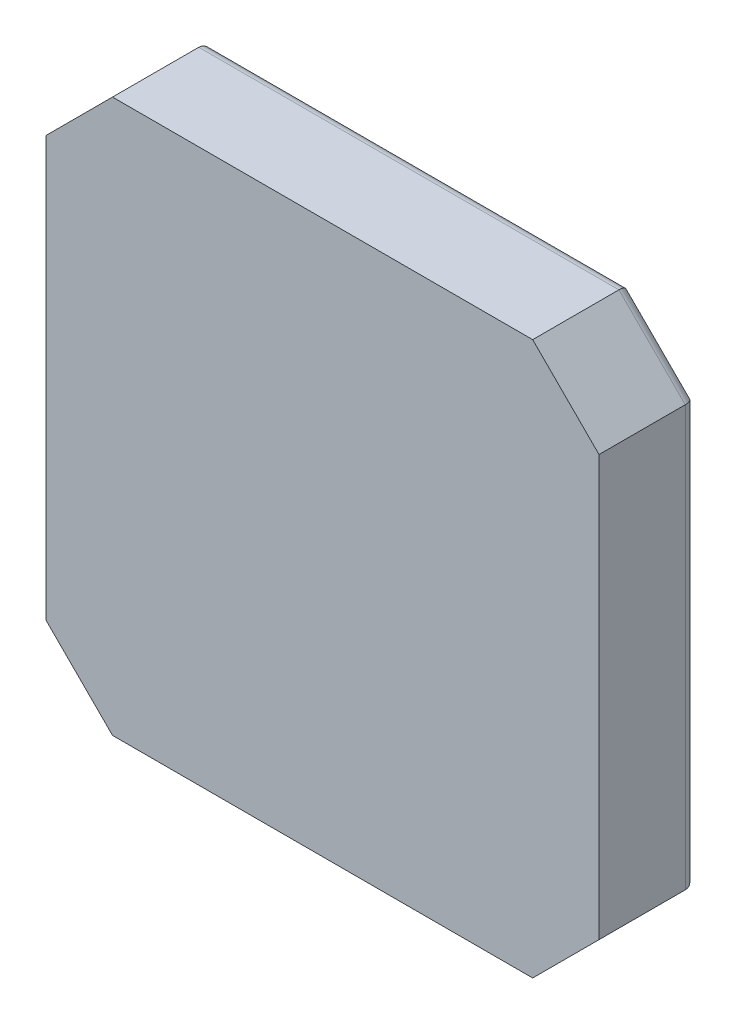
ISO-10303-21;
HEADER;
FILE_DESCRIPTION(('STEP AP214'),'2;1');
FILE_NAME('part.step','',(''),(''),'','','');
FILE_SCHEMA(('AUTOMOTIVE_DESIGN { 1 0 10303 214 1 1 1 1 }'));
ENDSEC;
DATA;
#1=APPLICATION_CONTEXT('core data for automotive mechanical design processes');
#2=APPLICATION_PROTOCOL_DEFINITION('international standard','automotive_design',2000,#1);
#3=PRODUCT_CONTEXT('',#1,'mechanical');
#4=PRODUCT('Part','Part','',(#3));
#5=PRODUCT_RELATED_PRODUCT_CATEGORY('part','',(#4));
#6=PRODUCT_DEFINITION_FORMATION('','',#4);
#7=PRODUCT_DEFINITION_CONTEXT('part definition',#1,'design');
#8=PRODUCT_DEFINITION('design','',#6,#7);
#9=PRODUCT_DEFINITION_SHAPE('','',#8);
#10=(LENGTH_UNIT() NAMED_UNIT(*) SI_UNIT(.MILLI.,.METRE.));
#11=(NAMED_UNIT(*) PLANE_ANGLE_UNIT() SI_UNIT($,.RADIAN.));
#12=(NAMED_UNIT(*) SI_UNIT($,.STERADIAN.) SOLID_ANGLE_UNIT());
#13=UNCERTAINTY_MEASURE_WITH_UNIT(LENGTH_MEASURE(1.E-05),#10,'distance_accuracy_value','');
#14=(GEOMETRIC_REPRESENTATION_CONTEXT(3) GLOBAL_UNCERTAINTY_ASSIGNED_CONTEXT((#13)) GLOBAL_UNIT_ASSIGNED_CONTEXT((#10,
#11,#12)) REPRESENTATION_CONTEXT('',''));
#15=CARTESIAN_POINT('',(0.,0.,0.));
#16=DIRECTION('',(0.,0.,1.));
#17=DIRECTION('',(1.,0.,0.));
#18=AXIS2_PLACEMENT_3D('',#15,#16,#17);
#19=CARTESIAN_POINT('',(0.,0.,3.1));
#20=DIRECTION('',(0.,0.,-1.));
#21=DIRECTION('',(-1.,0.,0.));
#22=AXIS2_PLACEMENT_3D('',#19,#20,#21);
#23=PLANE('',#22);
#24=DIRECTION('',(0.,1.,0.));
#25=VECTOR('',#24,1.);
#26=CARTESIAN_POINT('',(13.5,0.,3.1));
#27=LINE('',#26,#25);
#28=CARTESIAN_POINT('',(13.5,-7.2928932188134,3.1));
#29=VERTEX_POINT('',#28);
#30=CARTESIAN_POINT('',(13.5,11.2928932188134,3.1));
#31=VERTEX_POINT('',#30);
#32=EDGE_CURVE('E130',#29,#31,#27,.T.);
#33=ORIENTED_EDGE('',*,*,#32,.F.);
#34=DIRECTION('',(0.707106781186548,0.707106781186548,0.));
#35=VECTOR('',#34,1.);
#36=CARTESIAN_POINT('',(10.3964466094067,-10.3964466094067,3.1));
#37=LINE('',#36,#35);
#38=CARTESIAN_POINT('',(10.7928932188134,-10.,3.1));
#39=VERTEX_POINT('',#38);
#40=EDGE_CURVE('E133',#39,#29,#37,.T.);
#41=ORIENTED_EDGE('',*,*,#40,.F.);
#42=DIRECTION('',(1.,0.,0.));
#43=VECTOR('',#42,1.);
#44=CARTESIAN_POINT('',(0.,-10.,3.1));
#45=LINE('',#44,#43);
#46=CARTESIAN_POINT('',(-7.7928932188134,-10.,3.1));
#47=VERTEX_POINT('',#46);
#48=EDGE_CURVE('E136',#47,#39,#45,.T.);
#49=ORIENTED_EDGE('',*,*,#48,.F.);
#50=DIRECTION('',(0.707106781186548,-0.707106781186547,0.));
#51=VECTOR('',#50,1.);
#52=CARTESIAN_POINT('',(-8.8964466094067,-8.8964466094067,3.1));
#53=LINE('',#52,#51);
#54=CARTESIAN_POINT('',(-10.5,-7.2928932188134,3.1));
#55=VERTEX_POINT('',#54);
#56=EDGE_CURVE('E139',#55,#47,#53,.T.);
#57=ORIENTED_EDGE('',*,*,#56,.F.);
#58=DIRECTION('',(0.,-1.,0.));
#59=VECTOR('',#58,1.);
#60=CARTESIAN_POINT('',(-10.5,0.,3.1));
#61=LINE('',#60,#59);
#62=CARTESIAN_POINT('',(-10.5,11.2928932188135,3.1));
#63=VERTEX_POINT('',#62);
#64=EDGE_CURVE('E115',#63,#55,#61,.T.);
#65=ORIENTED_EDGE('',*,*,#64,.F.);
#66=DIRECTION('',(-0.707106781186548,-0.707106781186548,0.));
#67=VECTOR('',#66,1.);
#68=CARTESIAN_POINT('',(-10.8964466094068,10.8964466094068,3.1));
#69=LINE('',#68,#67);
#70=CARTESIAN_POINT('',(-7.79289321881345,14.,3.1));
#71=VERTEX_POINT('',#70);
#72=EDGE_CURVE('E111',#71,#63,#69,.T.);
#73=ORIENTED_EDGE('',*,*,#72,.F.);
#74=DIRECTION('',(-1.,0.,0.));
#75=VECTOR('',#74,1.);
#76=CARTESIAN_POINT('',(0.,14.,3.1));
#77=LINE('',#76,#75);
#78=CARTESIAN_POINT('',(10.7928932188134,14.,3.1));
#79=VERTEX_POINT('',#78);
#80=EDGE_CURVE('E102',#79,#71,#77,.T.);
#81=ORIENTED_EDGE('',*,*,#80,.F.);
#82=DIRECTION('',(-0.707106781186548,0.707106781186547,0.));
#83=VECTOR('',#82,1.);
#84=CARTESIAN_POINT('',(12.3964466094067,12.3964466094067,3.1));
#85=LINE('',#84,#83);
#86=EDGE_CURVE('E123',#31,#79,#85,.T.);
#87=ORIENTED_EDGE('',*,*,#86,.F.);
#88=EDGE_LOOP('',(#33,#41,#49,#57,#65,#73,#81,#87));
#89=FACE_BOUND('',#88,.T.);
#90=ADVANCED_FACE('F17',(#89),#23,.T.);
#91=CARTESIAN_POINT('',(-10.8964466094067,10.8964466094067,3.6));
#92=DIRECTION('',(-0.707106781186548,-0.707106781186548,0.));
#93=DIRECTION('',(0.707106781186548,-0.707106781186548,0.));
#94=AXIS2_PLACEMENT_3D('',#91,#92,#93);
#95=CYLINDRICAL_SURFACE('',#94,0.5);
#96=CARTESIAN_POINT('',(-10.5,11.2928932188134,3.6));
#97=DIRECTION('',(-0.38268343236509,-0.923879532511287,0.));
#98=DIRECTION('',(0.923879532511287,-0.38268343236509,0.));
#99=AXIS2_PLACEMENT_3D('',#96,#97,#98);
#100=ELLIPSE('',#99,0.541196100146197,0.5);
#101=CARTESIAN_POINT('',(-11.,11.5,3.6));
#102=VERTEX_POINT('',#101);
#103=EDGE_CURVE('E140',#102,#63,#100,.T.);
#104=ORIENTED_EDGE('',*,*,#103,.F.);
#105=DIRECTION('',(0.707106781186548,0.707106781186548,0.));
#106=VECTOR('',#105,1.);
#107=CARTESIAN_POINT('',(-8.,14.5,3.6));
#108=LINE('',#107,#106);
#109=CARTESIAN_POINT('',(-7.99999999999998,14.5,3.6));
#110=VERTEX_POINT('',#109);
#111=EDGE_CURVE('E121',#102,#110,#108,.T.);
#112=ORIENTED_EDGE('',*,*,#111,.T.);
#113=CARTESIAN_POINT('',(-7.7928932188134,14.,3.6));
#114=DIRECTION('',(-0.923879532511287,-0.38268343236509,0.));
#115=DIRECTION('',(-0.38268343236509,0.923879532511287,0.));
#116=AXIS2_PLACEMENT_3D('',#113,#114,#115);
#117=ELLIPSE('',#116,0.541196100146197,0.5);
#118=EDGE_CURVE('E20',#71,#110,#117,.F.);
#119=ORIENTED_EDGE('',*,*,#118,.F.);
#120=ORIENTED_EDGE('',*,*,#72,.T.);
#121=EDGE_LOOP('',(#104,#112,#119,#120));
#122=FACE_BOUND('',#121,.T.);
#123=ADVANCED_FACE('F120',(#122),#95,.T.);
#124=CARTESIAN_POINT('',(0.,14.,3.6));
#125=DIRECTION('',(-1.,0.,0.));
#126=DIRECTION('',(0.,0.,1.));
#127=AXIS2_PLACEMENT_3D('',#124,#125,#126);
#128=CYLINDRICAL_SURFACE('',#127,0.5);
#129=ORIENTED_EDGE('',*,*,#118,.T.);
#130=DIRECTION('',(1.,0.,0.));
#131=VECTOR('',#130,1.);
#132=CARTESIAN_POINT('',(-11.,14.5,3.6));
#133=LINE('',#132,#131);
#134=CARTESIAN_POINT('',(11.,14.5,3.6));
#135=VERTEX_POINT('',#134);
#136=EDGE_CURVE('E155',#110,#135,#133,.T.);
#137=ORIENTED_EDGE('',*,*,#136,.T.);
#138=CARTESIAN_POINT('',(10.7928932188134,14.,3.6));
#139=DIRECTION('',(-0.923879532511287,0.382683432365089,0.));
#140=DIRECTION('',(0.382683432365089,0.923879532511287,0.));
#141=AXIS2_PLACEMENT_3D('',#138,#139,#140);
#142=ELLIPSE('',#141,0.541196100146197,0.5);
#143=EDGE_CURVE('E108',#79,#135,#142,.F.);
#144=ORIENTED_EDGE('',*,*,#143,.F.);
#145=ORIENTED_EDGE('',*,*,#80,.T.);
#146=EDGE_LOOP('',(#129,#137,#144,#145));
#147=FACE_BOUND('',#146,.T.);
#148=ADVANCED_FACE('F104',(#147),#128,.T.);
#149=CARTESIAN_POINT('',(12.3964466094067,12.3964466094067,3.6));
#150=DIRECTION('',(-0.707106781186548,0.707106781186547,0.));
#151=DIRECTION('',(-0.707106781186547,-0.707106781186548,0.));
#152=AXIS2_PLACEMENT_3D('',#149,#150,#151);
#153=CYLINDRICAL_SURFACE('',#152,0.5);
#154=CARTESIAN_POINT('',(13.5,11.2928932188134,3.6));
#155=DIRECTION('',(-0.38268343236509,0.923879532511287,0.));
#156=DIRECTION('',(0.923879532511287,0.38268343236509,0.));
#157=AXIS2_PLACEMENT_3D('',#154,#155,#156);
#158=ELLIPSE('',#157,0.541196100146197,0.5);
#159=CARTESIAN_POINT('',(14.,11.5,3.6));
#160=VERTEX_POINT('',#159);
#161=EDGE_CURVE('E126',#31,#160,#158,.F.);
#162=ORIENTED_EDGE('',*,*,#161,.F.);
#163=ORIENTED_EDGE('',*,*,#86,.T.);
#164=ORIENTED_EDGE('',*,*,#143,.T.);
#165=DIRECTION('',(0.707106781186548,-0.707106781186547,0.));
#166=VECTOR('',#165,1.);
#167=CARTESIAN_POINT('',(14.,11.5,3.6));
#168=LINE('',#167,#166);
#169=EDGE_CURVE('E167',#135,#160,#168,.T.);
#170=ORIENTED_EDGE('',*,*,#169,.T.);
#171=EDGE_LOOP('',(#162,#163,#164,#170));
#172=FACE_BOUND('',#171,.T.);
#173=ADVANCED_FACE('F399',(#172),#153,.T.);
#174=CARTESIAN_POINT('',(13.5,0.,3.6));
#175=DIRECTION('',(0.,1.,0.));
#176=DIRECTION('',(0.,0.,1.));
#177=AXIS2_PLACEMENT_3D('',#174,#175,#176);
#178=CYLINDRICAL_SURFACE('',#177,0.5);
#179=CARTESIAN_POINT('',(13.5,-7.2928932188134,3.6));
#180=DIRECTION('',(0.38268343236509,0.923879532511287,0.));
#181=DIRECTION('',(0.923879532511287,-0.38268343236509,0.));
#182=AXIS2_PLACEMENT_3D('',#179,#180,#181);
#183=ELLIPSE('',#182,0.541196100146197,0.5);
#184=CARTESIAN_POINT('',(14.,-7.49999999999998,3.6));
#185=VERTEX_POINT('',#184);
#186=EDGE_CURVE('E131',#29,#185,#183,.F.);
#187=ORIENTED_EDGE('',*,*,#186,.F.);
#188=ORIENTED_EDGE('',*,*,#32,.T.);
#189=ORIENTED_EDGE('',*,*,#161,.T.);
#190=DIRECTION('',(0.,1.,0.));
#191=VECTOR('',#190,1.);
#192=CARTESIAN_POINT('',(14.,14.5,3.6));
#193=LINE('',#192,#191);
#194=EDGE_CURVE('E180',#160,#185,#193,.F.);
#195=ORIENTED_EDGE('',*,*,#194,.T.);
#196=EDGE_LOOP('',(#187,#188,#189,#195));
#197=FACE_BOUND('',#196,.T.);
#198=ADVANCED_FACE('F390',(#197),#178,.T.);
#199=CARTESIAN_POINT('',(10.3964466094067,-10.3964466094067,3.6));
#200=DIRECTION('',(0.707106781186548,0.707106781186548,0.));
#201=DIRECTION('',(-0.707106781186548,0.707106781186548,0.));
#202=AXIS2_PLACEMENT_3D('',#199,#200,#201);
#203=CYLINDRICAL_SURFACE('',#202,0.5);
#204=CARTESIAN_POINT('',(10.7928932188134,-10.,3.6));
#205=DIRECTION('',(0.923879532511287,0.38268343236509,0.));
#206=DIRECTION('',(0.38268343236509,-0.923879532511287,0.));
#207=AXIS2_PLACEMENT_3D('',#204,#205,#206);
#208=ELLIPSE('',#207,0.541196100146197,0.5);
#209=CARTESIAN_POINT('',(11.,-10.5,3.6));
#210=VERTEX_POINT('',#209);
#211=EDGE_CURVE('E134',#39,#210,#208,.F.);
#212=ORIENTED_EDGE('',*,*,#211,.F.);
#213=ORIENTED_EDGE('',*,*,#40,.T.);
#214=ORIENTED_EDGE('',*,*,#186,.T.);
#215=DIRECTION('',(-0.707106781186548,-0.707106781186548,0.));
#216=VECTOR('',#215,1.);
#217=CARTESIAN_POINT('',(11.,-10.5,3.6));
#218=LINE('',#217,#216);
#219=EDGE_CURVE('E195',#185,#210,#218,.T.);
#220=ORIENTED_EDGE('',*,*,#219,.T.);
#221=EDGE_LOOP('',(#212,#213,#214,#220));
#222=FACE_BOUND('',#221,.T.);
#223=ADVANCED_FACE('F381',(#222),#203,.T.);
#224=CARTESIAN_POINT('',(0.,-10.,3.6));
#225=DIRECTION('',(1.,0.,0.));
#226=DIRECTION('',(0.,0.,-1.));
#227=AXIS2_PLACEMENT_3D('',#224,#225,#226);
#228=CYLINDRICAL_SURFACE('',#227,0.5);
#229=CARTESIAN_POINT('',(-7.7928932188134,-10.,3.6));
#230=DIRECTION('',(0.923879532511287,-0.382683432365089,0.));
#231=DIRECTION('',(-0.382683432365089,-0.923879532511287,0.));
#232=AXIS2_PLACEMENT_3D('',#229,#230,#231);
#233=ELLIPSE('',#232,0.541196100146197,0.5);
#234=CARTESIAN_POINT('',(-7.99999999999998,-10.5,3.6));
#235=VERTEX_POINT('',#234);
#236=EDGE_CURVE('E137',#47,#235,#233,.F.);
#237=ORIENTED_EDGE('',*,*,#236,.F.);
#238=ORIENTED_EDGE('',*,*,#48,.T.);
#239=ORIENTED_EDGE('',*,*,#211,.T.);
#240=DIRECTION('',(1.,0.,0.));
#241=VECTOR('',#240,1.);
#242=CARTESIAN_POINT('',(14.,-10.5,3.6));
#243=LINE('',#242,#241);
#244=EDGE_CURVE('E210',#210,#235,#243,.F.);
#245=ORIENTED_EDGE('',*,*,#244,.T.);
#246=EDGE_LOOP('',(#237,#238,#239,#245));
#247=FACE_BOUND('',#246,.T.);
#248=ADVANCED_FACE('F373',(#247),#228,.T.);
#249=CARTESIAN_POINT('',(-8.8964466094067,-8.8964466094067,3.6));
#250=DIRECTION('',(0.707106781186548,-0.707106781186547,0.));
#251=DIRECTION('',(0.707106781186547,0.707106781186548,0.));
#252=AXIS2_PLACEMENT_3D('',#249,#250,#251);
#253=CYLINDRICAL_SURFACE('',#252,0.5);
#254=CARTESIAN_POINT('',(-10.5,-7.2928932188134,3.6));
#255=DIRECTION('',(0.38268343236509,-0.923879532511287,0.));
#256=DIRECTION('',(-0.923879532511287,-0.38268343236509,0.));
#257=AXIS2_PLACEMENT_3D('',#254,#255,#256);
#258=ELLIPSE('',#257,0.541196100146197,0.5);
#259=CARTESIAN_POINT('',(-11.,-7.49999999999998,3.6));
#260=VERTEX_POINT('',#259);
#261=EDGE_CURVE('E142',#55,#260,#258,.F.);
#262=ORIENTED_EDGE('',*,*,#261,.F.);
#263=ORIENTED_EDGE('',*,*,#56,.T.);
#264=ORIENTED_EDGE('',*,*,#236,.T.);
#265=DIRECTION('',(-0.707106781186548,0.707106781186547,0.));
#266=VECTOR('',#265,1.);
#267=CARTESIAN_POINT('',(-11.,-7.5,3.6));
#268=LINE('',#267,#266);
#269=EDGE_CURVE('E224',#235,#260,#268,.T.);
#270=ORIENTED_EDGE('',*,*,#269,.T.);
#271=EDGE_LOOP('',(#262,#263,#264,#270));
#272=FACE_BOUND('',#271,.T.);
#273=ADVANCED_FACE('F249',(#272),#253,.T.);
#274=CARTESIAN_POINT('',(-10.5,0.,3.6));
#275=DIRECTION('',(0.,-1.,0.));
#276=DIRECTION('',(0.,0.,-1.));
#277=AXIS2_PLACEMENT_3D('',#274,#275,#276);
#278=CYLINDRICAL_SURFACE('',#277,0.5);
#279=ORIENTED_EDGE('',*,*,#261,.T.);
#280=DIRECTION('',(0.,1.,0.));
#281=VECTOR('',#280,1.);
#282=CARTESIAN_POINT('',(-11.,-10.5,3.6));
#283=LINE('',#282,#281);
#284=EDGE_CURVE('E238',#260,#102,#283,.T.);
#285=ORIENTED_EDGE('',*,*,#284,.T.);
#286=ORIENTED_EDGE('',*,*,#103,.T.);
#287=ORIENTED_EDGE('',*,*,#64,.T.);
#288=EDGE_LOOP('',(#279,#285,#286,#287));
#289=FACE_BOUND('',#288,.T.);
#290=ADVANCED_FACE('F245',(#289),#278,.T.);
#291=CARTESIAN_POINT('',(-8.,14.5,3.1));
#292=DIRECTION('',(0.707106781186548,-0.707106781186548,0.));
#293=DIRECTION('',(0.707106781186548,0.707106781186548,0.));
#294=AXIS2_PLACEMENT_3D('',#291,#292,#293);
#295=PLANE('',#294);
#296=ORIENTED_EDGE('',*,*,#111,.F.);
#297=DIRECTION('',(0.,0.,-1.));
#298=VECTOR('',#297,1.);
#299=CARTESIAN_POINT('',(-11.,11.5,3.1));
#300=LINE('',#299,#298);
#301=CARTESIAN_POINT('',(-11.,11.5,7.5));
#302=VERTEX_POINT('',#301);
#303=EDGE_CURVE('E150',#102,#302,#300,.F.);
#304=ORIENTED_EDGE('',*,*,#303,.T.);
#305=DIRECTION('',(0.707106781186547,0.707106781186548,0.));
#306=VECTOR('',#305,1.);
#307=CARTESIAN_POINT('',(-11.,11.5,7.5));
#308=LINE('',#307,#306);
#309=CARTESIAN_POINT('',(-8.,14.5,7.5));
#310=VERTEX_POINT('',#309);
#311=EDGE_CURVE('E146',#302,#310,#308,.T.);
#312=ORIENTED_EDGE('',*,*,#311,.T.);
#313=DIRECTION('',(0.,0.,-1.));
#314=VECTOR('',#313,1.);
#315=CARTESIAN_POINT('',(-8.,14.5,3.1));
#316=LINE('',#315,#314);
#317=EDGE_CURVE('E153',#310,#110,#316,.T.);
#318=ORIENTED_EDGE('',*,*,#317,.T.);
#319=EDGE_LOOP('',(#296,#304,#312,#318));
#320=FACE_BOUND('',#319,.T.);
#321=ADVANCED_FACE('F279',(#320),#295,.F.);
#322=CARTESIAN_POINT('',(-11.,14.5,3.1));
#323=DIRECTION('',(0.,-1.,0.));
#324=DIRECTION('',(0.,0.,-1.));
#325=AXIS2_PLACEMENT_3D('',#322,#323,#324);
#326=PLANE('',#325);
#327=ORIENTED_EDGE('',*,*,#136,.F.);
#328=ORIENTED_EDGE('',*,*,#317,.F.);
#329=DIRECTION('',(-1.,0.,0.));
#330=VECTOR('',#329,1.);
#331=CARTESIAN_POINT('',(0.,14.5,7.5));
#332=LINE('',#331,#330);
#333=CARTESIAN_POINT('',(11.,14.5,7.5));
#334=VERTEX_POINT('',#333);
#335=EDGE_CURVE('E149',#310,#334,#332,.F.);
#336=ORIENTED_EDGE('',*,*,#335,.T.);
#337=DIRECTION('',(0.,0.,1.));
#338=VECTOR('',#337,1.);
#339=CARTESIAN_POINT('',(11.,14.5,3.1));
#340=LINE('',#339,#338);
#341=EDGE_CURVE('E163',#334,#135,#340,.F.);
#342=ORIENTED_EDGE('',*,*,#341,.T.);
#343=EDGE_LOOP('',(#327,#328,#336,#342));
#344=FACE_BOUND('',#343,.T.);
#345=ADVANCED_FACE('F277',(#344),#326,.F.);
#346=CARTESIAN_POINT('',(14.,11.5,3.1));
#347=DIRECTION('',(-0.707106781186547,-0.707106781186548,0.));
#348=DIRECTION('',(0.707106781186548,-0.707106781186547,0.));
#349=AXIS2_PLACEMENT_3D('',#346,#347,#348);
#350=PLANE('',#349);
#351=ORIENTED_EDGE('',*,*,#169,.F.);
#352=ORIENTED_EDGE('',*,*,#341,.F.);
#353=DIRECTION('',(0.707106781186547,-0.707106781186547,0.));
#354=VECTOR('',#353,1.);
#355=CARTESIAN_POINT('',(11.,14.5,7.5));
#356=LINE('',#355,#354);
#357=CARTESIAN_POINT('',(14.,11.5,7.5));
#358=VERTEX_POINT('',#357);
#359=EDGE_CURVE('E161',#334,#358,#356,.T.);
#360=ORIENTED_EDGE('',*,*,#359,.T.);
#361=DIRECTION('',(0.,0.,1.));
#362=VECTOR('',#361,1.);
#363=CARTESIAN_POINT('',(14.,11.5,3.1));
#364=LINE('',#363,#362);
#365=EDGE_CURVE('E175',#358,#160,#364,.F.);
#366=ORIENTED_EDGE('',*,*,#365,.T.);
#367=EDGE_LOOP('',(#351,#352,#360,#366));
#368=FACE_BOUND('',#367,.T.);
#369=ADVANCED_FACE('F274',(#368),#350,.F.);
#370=CARTESIAN_POINT('',(14.,14.5,3.1));
#371=DIRECTION('',(-1.,0.,0.));
#372=DIRECTION('',(0.,0.,1.));
#373=AXIS2_PLACEMENT_3D('',#370,#371,#372);
#374=PLANE('',#373);
#375=ORIENTED_EDGE('',*,*,#194,.F.);
#376=ORIENTED_EDGE('',*,*,#365,.F.);
#377=DIRECTION('',(0.,1.,0.));
#378=VECTOR('',#377,1.);
#379=CARTESIAN_POINT('',(14.,0.,7.5));
#380=LINE('',#379,#378);
#381=CARTESIAN_POINT('',(14.,-7.5,7.5));
#382=VERTEX_POINT('',#381);
#383=EDGE_CURVE('E173',#358,#382,#380,.F.);
#384=ORIENTED_EDGE('',*,*,#383,.T.);
#385=DIRECTION('',(0.,0.,1.));
#386=VECTOR('',#385,1.);
#387=CARTESIAN_POINT('',(14.,-7.5,3.1));
#388=LINE('',#387,#386);
#389=EDGE_CURVE('E190',#382,#185,#388,.F.);
#390=ORIENTED_EDGE('',*,*,#389,.T.);
#391=EDGE_LOOP('',(#375,#376,#384,#390));
#392=FACE_BOUND('',#391,.T.);
#393=ADVANCED_FACE('F271',(#392),#374,.F.);
#394=CARTESIAN_POINT('',(11.,-10.5,3.1));
#395=DIRECTION('',(-0.707106781186548,0.707106781186548,0.));
#396=DIRECTION('',(-0.707106781186548,-0.707106781186548,0.));
#397=AXIS2_PLACEMENT_3D('',#394,#395,#396);
#398=PLANE('',#397);
#399=ORIENTED_EDGE('',*,*,#219,.F.);
#400=ORIENTED_EDGE('',*,*,#389,.F.);
#401=DIRECTION('',(-0.707106781186547,-0.707106781186547,0.));
#402=VECTOR('',#401,1.);
#403=CARTESIAN_POINT('',(14.,-7.5,7.5));
#404=LINE('',#403,#402);
#405=CARTESIAN_POINT('',(11.,-10.5,7.5));
#406=VERTEX_POINT('',#405);
#407=EDGE_CURVE('E187',#382,#406,#404,.T.);
#408=ORIENTED_EDGE('',*,*,#407,.T.);
#409=DIRECTION('',(0.,0.,1.));
#410=VECTOR('',#409,1.);
#411=CARTESIAN_POINT('',(11.,-10.5,3.1));
#412=LINE('',#411,#410);
#413=EDGE_CURVE('E205',#406,#210,#412,.F.);
#414=ORIENTED_EDGE('',*,*,#413,.T.);
#415=EDGE_LOOP('',(#399,#400,#408,#414));
#416=FACE_BOUND('',#415,.T.);
#417=ADVANCED_FACE('F266',(#416),#398,.F.);
#418=CARTESIAN_POINT('',(14.,-10.5,3.1));
#419=DIRECTION('',(0.,1.,0.));
#420=DIRECTION('',(0.,0.,1.));
#421=AXIS2_PLACEMENT_3D('',#418,#419,#420);
#422=PLANE('',#421);
#423=ORIENTED_EDGE('',*,*,#244,.F.);
#424=ORIENTED_EDGE('',*,*,#413,.F.);
#425=DIRECTION('',(-1.,0.,0.));
#426=VECTOR('',#425,1.);
#427=CARTESIAN_POINT('',(0.,-10.5,7.5));
#428=LINE('',#427,#426);
#429=CARTESIAN_POINT('',(-8.,-10.5,7.5));
#430=VERTEX_POINT('',#429);
#431=EDGE_CURVE('E202',#406,#430,#428,.T.);
#432=ORIENTED_EDGE('',*,*,#431,.T.);
#433=DIRECTION('',(0.,0.,1.));
#434=VECTOR('',#433,1.);
#435=CARTESIAN_POINT('',(-8.,-10.5,3.1));
#436=LINE('',#435,#434);
#437=EDGE_CURVE('E219',#430,#235,#436,.F.);
#438=ORIENTED_EDGE('',*,*,#437,.T.);
#439=EDGE_LOOP('',(#423,#424,#432,#438));
#440=FACE_BOUND('',#439,.T.);
#441=ADVANCED_FACE('F263',(#440),#422,.F.);
#442=CARTESIAN_POINT('',(-11.,-7.5,3.1));
#443=DIRECTION('',(0.707106781186547,0.707106781186548,0.));
#444=DIRECTION('',(-0.707106781186548,0.707106781186547,0.));
#445=AXIS2_PLACEMENT_3D('',#442,#443,#444);
#446=PLANE('',#445);
#447=ORIENTED_EDGE('',*,*,#269,.F.);
#448=ORIENTED_EDGE('',*,*,#437,.F.);
#449=DIRECTION('',(-0.707106781186547,0.707106781186548,0.));
#450=VECTOR('',#449,1.);
#451=CARTESIAN_POINT('',(-8.,-10.5,7.5));
#452=LINE('',#451,#450);
#453=CARTESIAN_POINT('',(-11.,-7.5,7.5));
#454=VERTEX_POINT('',#453);
#455=EDGE_CURVE('E26',#430,#454,#452,.T.);
#456=ORIENTED_EDGE('',*,*,#455,.T.);
#457=DIRECTION('',(0.,0.,-1.));
#458=VECTOR('',#457,1.);
#459=CARTESIAN_POINT('',(-11.,-7.5,3.1));
#460=LINE('',#459,#458);
#461=EDGE_CURVE('E34',#454,#260,#460,.T.);
#462=ORIENTED_EDGE('',*,*,#461,.T.);
#463=EDGE_LOOP('',(#447,#448,#456,#462));
#464=FACE_BOUND('',#463,.T.);
#465=ADVANCED_FACE('F254',(#464),#446,.F.);
#466=CARTESIAN_POINT('',(-11.,-10.5,3.1));
#467=DIRECTION('',(1.,0.,0.));
#468=DIRECTION('',(0.,0.,-1.));
#469=AXIS2_PLACEMENT_3D('',#466,#467,#468);
#470=PLANE('',#469);
#471=ORIENTED_EDGE('',*,*,#284,.F.);
#472=ORIENTED_EDGE('',*,*,#461,.F.);
#473=DIRECTION('',(0.,1.,0.));
#474=VECTOR('',#473,1.);
#475=CARTESIAN_POINT('',(-11.,0.,7.5));
#476=LINE('',#475,#474);
#477=EDGE_CURVE('E11',#454,#302,#476,.T.);
#478=ORIENTED_EDGE('',*,*,#477,.T.);
#479=ORIENTED_EDGE('',*,*,#303,.F.);
#480=EDGE_LOOP('',(#471,#472,#478,#479));
#481=FACE_BOUND('',#480,.T.);
#482=ADVANCED_FACE('F253',(#481),#470,.F.);
#483=CARTESIAN_POINT('',(0.,0.,7.5));
#484=DIRECTION('',(0.,0.,-1.));
#485=DIRECTION('',(-1.,0.,0.));
#486=AXIS2_PLACEMENT_3D('',#483,#484,#485);
#487=PLANE('',#486);
#488=ORIENTED_EDGE('',*,*,#455,.F.);
#489=ORIENTED_EDGE('',*,*,#431,.F.);
#490=ORIENTED_EDGE('',*,*,#407,.F.);
#491=ORIENTED_EDGE('',*,*,#383,.F.);
#492=ORIENTED_EDGE('',*,*,#359,.F.);
#493=ORIENTED_EDGE('',*,*,#335,.F.);
#494=ORIENTED_EDGE('',*,*,#311,.F.);
#495=ORIENTED_EDGE('',*,*,#477,.F.);
#496=EDGE_LOOP('',(#488,#489,#490,#491,#492,#493,#494,#495));
#497=FACE_BOUND('',#496,.T.);
#498=ADVANCED_FACE('F258',(#497),#487,.F.);
#499=CLOSED_SHELL('',(#90,#123,#148,#173,#198,#223,#248,#273,#290,#321,#345,#369,#393,#417,#441,
#465,#482,#498));
#500=MANIFOLD_SOLID_BREP('B1',#499);
#501=ADVANCED_BREP_SHAPE_REPRESENTATION('',(#18,#500),#14);
#502=SHAPE_DEFINITION_REPRESENTATION(#9,#501);
ENDSEC;
END-ISO-10303-21;
